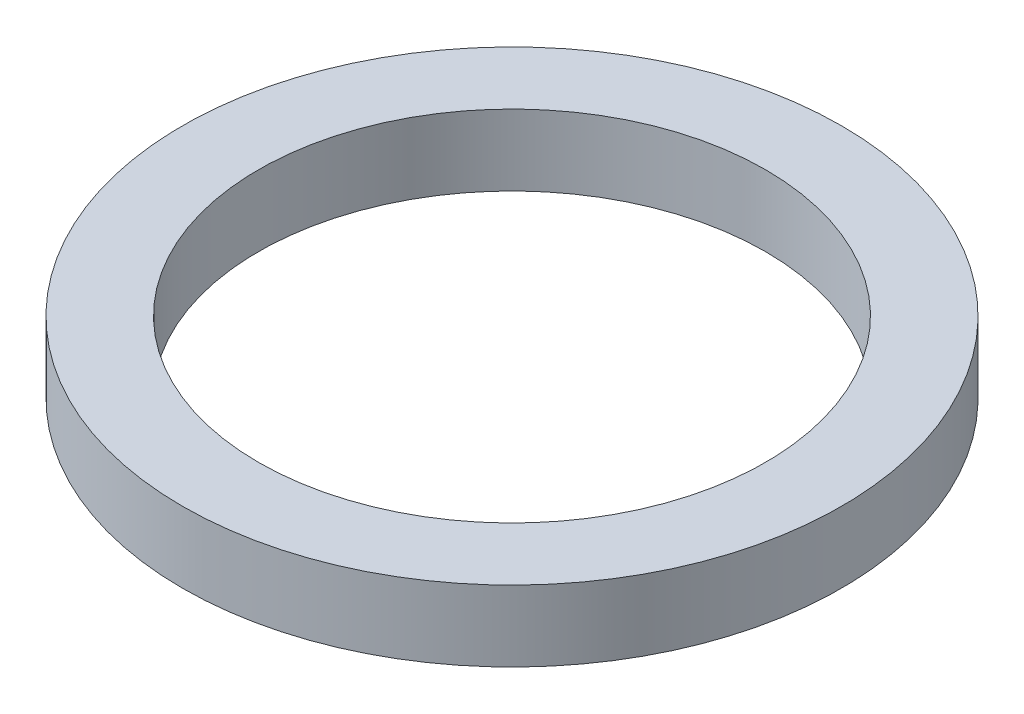
ISO-10303-21;
HEADER;
FILE_DESCRIPTION(('STEP AP214'),'2;1');
FILE_NAME('part.step','',(''),(''),'','','');
FILE_SCHEMA(('AUTOMOTIVE_DESIGN { 1 0 10303 214 1 1 1 1 }'));
ENDSEC;
DATA;
#1=APPLICATION_CONTEXT('core data for automotive mechanical design processes');
#2=APPLICATION_PROTOCOL_DEFINITION('international standard','automotive_design',2000,#1);
#3=PRODUCT_CONTEXT('',#1,'mechanical');
#4=PRODUCT('Part','Part','',(#3));
#5=PRODUCT_RELATED_PRODUCT_CATEGORY('part','',(#4));
#6=PRODUCT_DEFINITION_FORMATION('','',#4);
#7=PRODUCT_DEFINITION_CONTEXT('part definition',#1,'design');
#8=PRODUCT_DEFINITION('design','',#6,#7);
#9=PRODUCT_DEFINITION_SHAPE('','',#8);
#10=(LENGTH_UNIT() NAMED_UNIT(*) SI_UNIT(.MILLI.,.METRE.));
#11=(NAMED_UNIT(*) PLANE_ANGLE_UNIT() SI_UNIT($,.RADIAN.));
#12=(NAMED_UNIT(*) SI_UNIT($,.STERADIAN.) SOLID_ANGLE_UNIT());
#13=UNCERTAINTY_MEASURE_WITH_UNIT(LENGTH_MEASURE(1.E-05),#10,'distance_accuracy_value','');
#14=(GEOMETRIC_REPRESENTATION_CONTEXT(3) GLOBAL_UNCERTAINTY_ASSIGNED_CONTEXT((#13)) GLOBAL_UNIT_ASSIGNED_CONTEXT((#10,
#11,#12)) REPRESENTATION_CONTEXT('',''));
#15=CARTESIAN_POINT('',(0.,0.,0.));
#16=DIRECTION('',(0.,0.,1.));
#17=DIRECTION('',(1.,0.,0.));
#18=AXIS2_PLACEMENT_3D('',#15,#16,#17);
#19=CARTESIAN_POINT('',(0.,3.5,0.));
#20=DIRECTION('',(0.,1.,0.));
#21=DIRECTION('',(0.,0.,1.));
#22=AXIS2_PLACEMENT_3D('',#19,#20,#21);
#23=PLANE('',#22);
#24=CARTESIAN_POINT('',(0.,3.5,0.));
#25=DIRECTION('',(0.,1.,0.));
#26=DIRECTION('',(0.,0.,1.));
#27=AXIS2_PLACEMENT_3D('',#24,#25,#26);
#28=CIRCLE('',#27,32.5);
#29=CARTESIAN_POINT('',(0.,3.5,32.5));
#30=VERTEX_POINT('',#29);
#31=EDGE_CURVE('E10',#30,#30,#28,.T.);
#32=ORIENTED_EDGE('',*,*,#31,.T.);
#33=EDGE_LOOP('',(#32));
#34=FACE_BOUND('',#33,.T.);
#35=CARTESIAN_POINT('',(0.,3.5,0.));
#36=DIRECTION('',(0.,1.,0.));
#37=DIRECTION('',(0.,0.,1.));
#38=AXIS2_PLACEMENT_3D('',#35,#36,#37);
#39=CIRCLE('',#38,25.);
#40=CARTESIAN_POINT('',(0.,3.5,25.));
#41=VERTEX_POINT('',#40);
#42=EDGE_CURVE('E48',#41,#41,#39,.T.);
#43=ORIENTED_EDGE('',*,*,#42,.F.);
#44=EDGE_LOOP('',(#43));
#45=FACE_BOUND('',#44,.T.);
#46=ADVANCED_FACE('F37',(#34,#45),#23,.T.);
#47=CARTESIAN_POINT('',(0.,-3.5,0.));
#48=DIRECTION('',(0.,1.,0.));
#49=DIRECTION('',(0.,0.,1.));
#50=AXIS2_PLACEMENT_3D('',#47,#48,#49);
#51=PLANE('',#50);
#52=CARTESIAN_POINT('',(0.,-3.5,0.));
#53=DIRECTION('',(0.,1.,0.));
#54=DIRECTION('',(0.,0.,1.));
#55=AXIS2_PLACEMENT_3D('',#52,#53,#54);
#56=CIRCLE('',#55,32.5);
#57=CARTESIAN_POINT('',(0.,-3.5,32.5));
#58=VERTEX_POINT('',#57);
#59=EDGE_CURVE('E41',#58,#58,#56,.T.);
#60=ORIENTED_EDGE('',*,*,#59,.F.);
#61=EDGE_LOOP('',(#60));
#62=FACE_BOUND('',#61,.T.);
#63=CARTESIAN_POINT('',(0.,-3.5,0.));
#64=DIRECTION('',(0.,1.,0.));
#65=DIRECTION('',(0.,0.,1.));
#66=AXIS2_PLACEMENT_3D('',#63,#64,#65);
#67=CIRCLE('',#66,25.);
#68=CARTESIAN_POINT('',(0.,-3.5,25.));
#69=VERTEX_POINT('',#68);
#70=EDGE_CURVE('E50',#69,#69,#67,.T.);
#71=ORIENTED_EDGE('',*,*,#70,.T.);
#72=EDGE_LOOP('',(#71));
#73=FACE_BOUND('',#72,.T.);
#74=ADVANCED_FACE('F60',(#62,#73),#51,.F.);
#75=CARTESIAN_POINT('',(0.,3.5,0.));
#76=DIRECTION('',(0.,-1.,0.));
#77=DIRECTION('',(0.,0.,-1.));
#78=AXIS2_PLACEMENT_3D('',#75,#76,#77);
#79=CYLINDRICAL_SURFACE('',#78,32.5);
#80=ORIENTED_EDGE('',*,*,#31,.F.);
#81=EDGE_LOOP('',(#80));
#82=FACE_BOUND('',#81,.T.);
#83=ORIENTED_EDGE('',*,*,#59,.T.);
#84=EDGE_LOOP('',(#83));
#85=FACE_BOUND('',#84,.T.);
#86=ADVANCED_FACE('F39',(#82,#85),#79,.T.);
#87=CARTESIAN_POINT('',(0.,3.5,0.));
#88=DIRECTION('',(0.,-1.,0.));
#89=DIRECTION('',(0.,0.,-1.));
#90=AXIS2_PLACEMENT_3D('',#87,#88,#89);
#91=CYLINDRICAL_SURFACE('',#90,25.);
#92=ORIENTED_EDGE('',*,*,#42,.T.);
#93=EDGE_LOOP('',(#92));
#94=FACE_BOUND('',#93,.T.);
#95=ORIENTED_EDGE('',*,*,#70,.F.);
#96=EDGE_LOOP('',(#95));
#97=FACE_BOUND('',#96,.T.);
#98=ADVANCED_FACE('F56',(#94,#97),#91,.F.);
#99=CLOSED_SHELL('',(#46,#74,#86,#98));
#100=MANIFOLD_SOLID_BREP('B2',#99);
#101=ADVANCED_BREP_SHAPE_REPRESENTATION('',(#18,#100),#14);
#102=SHAPE_DEFINITION_REPRESENTATION(#9,#101);
ENDSEC;
END-ISO-10303-21;
